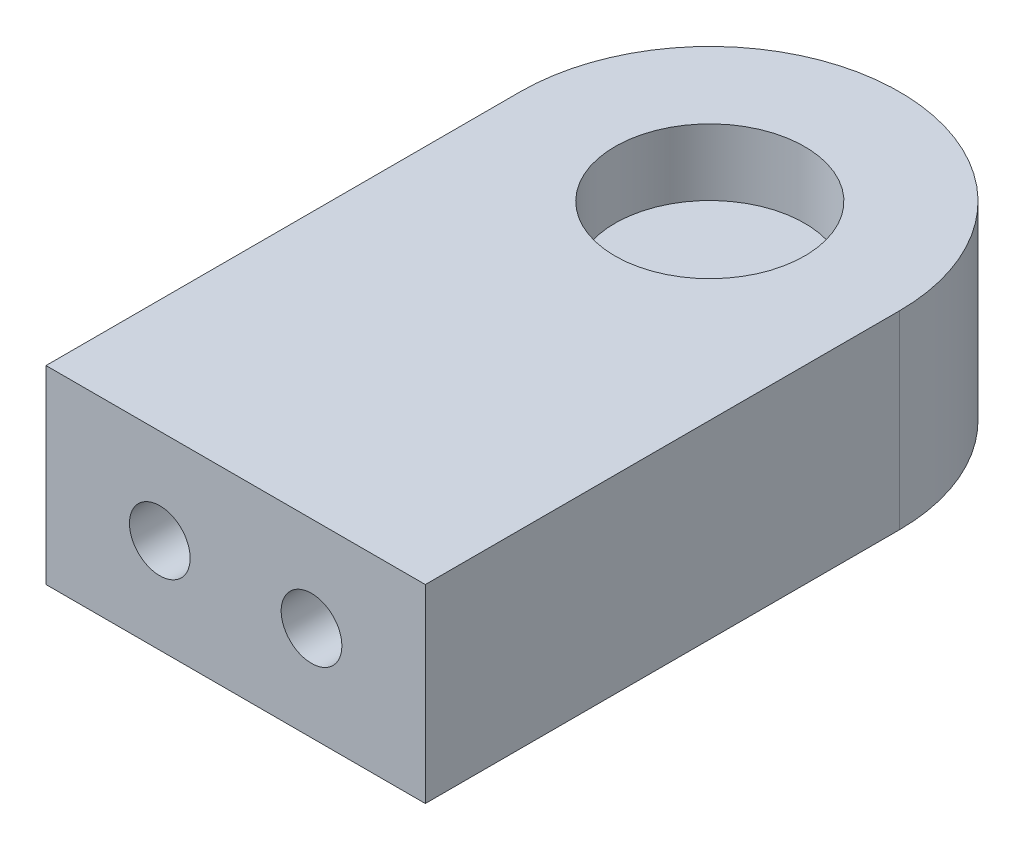
ISO-10303-21;
HEADER;
FILE_DESCRIPTION(('STEP AP214'),'2;1');
FILE_NAME('part.step','',(''),(''),'','','');
FILE_SCHEMA(('AUTOMOTIVE_DESIGN { 1 0 10303 214 1 1 1 1 }'));
ENDSEC;
DATA;
#1=APPLICATION_CONTEXT('core data for automotive mechanical design processes');
#2=APPLICATION_PROTOCOL_DEFINITION('international standard','automotive_design',2000,#1);
#3=PRODUCT_CONTEXT('',#1,'mechanical');
#4=PRODUCT('Part','Part','',(#3));
#5=PRODUCT_RELATED_PRODUCT_CATEGORY('part','',(#4));
#6=PRODUCT_DEFINITION_FORMATION('','',#4);
#7=PRODUCT_DEFINITION_CONTEXT('part definition',#1,'design');
#8=PRODUCT_DEFINITION('design','',#6,#7);
#9=PRODUCT_DEFINITION_SHAPE('','',#8);
#10=(LENGTH_UNIT() NAMED_UNIT(*) SI_UNIT(.MILLI.,.METRE.));
#11=(NAMED_UNIT(*) PLANE_ANGLE_UNIT() SI_UNIT($,.RADIAN.));
#12=(NAMED_UNIT(*) SI_UNIT($,.STERADIAN.) SOLID_ANGLE_UNIT());
#13=UNCERTAINTY_MEASURE_WITH_UNIT(LENGTH_MEASURE(1.E-05),#10,'distance_accuracy_value','');
#14=(GEOMETRIC_REPRESENTATION_CONTEXT(3) GLOBAL_UNCERTAINTY_ASSIGNED_CONTEXT((#13)) GLOBAL_UNIT_ASSIGNED_CONTEXT((#10,
#11,#12)) REPRESENTATION_CONTEXT('',''));
#15=CARTESIAN_POINT('',(0.,0.,0.));
#16=DIRECTION('',(0.,0.,1.));
#17=DIRECTION('',(1.,0.,0.));
#18=AXIS2_PLACEMENT_3D('',#15,#16,#17);
#19=CARTESIAN_POINT('',(20.,10.,0.));
#20=DIRECTION('',(0.,0.,-1.));
#21=DIRECTION('',(-1.,0.,0.));
#22=AXIS2_PLACEMENT_3D('',#19,#20,#21);
#23=PLANE('',#22);
#24=CARTESIAN_POINT('',(14.,5.,0.));
#25=DIRECTION('',(0.,0.,1.));
#26=DIRECTION('',(1.,0.,0.));
#27=AXIS2_PLACEMENT_3D('',#24,#25,#26);
#28=CIRCLE('',#27,1.6);
#29=CARTESIAN_POINT('',(15.6,5.,0.));
#30=VERTEX_POINT('',#29);
#31=EDGE_CURVE('E132',#30,#30,#28,.T.);
#32=ORIENTED_EDGE('',*,*,#31,.F.);
#33=EDGE_LOOP('',(#32));
#34=FACE_BOUND('',#33,.T.);
#35=CARTESIAN_POINT('',(6.,5.,0.));
#36=DIRECTION('',(0.,0.,1.));
#37=DIRECTION('',(1.,0.,0.));
#38=AXIS2_PLACEMENT_3D('',#35,#36,#37);
#39=CIRCLE('',#38,1.6);
#40=CARTESIAN_POINT('',(7.6,5.,0.));
#41=VERTEX_POINT('',#40);
#42=EDGE_CURVE('E126',#41,#41,#39,.T.);
#43=ORIENTED_EDGE('',*,*,#42,.F.);
#44=EDGE_LOOP('',(#43));
#45=FACE_BOUND('',#44,.T.);
#46=DIRECTION('',(1.,0.,0.));
#47=VECTOR('',#46,1.);
#48=CARTESIAN_POINT('',(20.,0.,0.));
#49=LINE('',#48,#47);
#50=CARTESIAN_POINT('',(0.,0.,0.));
#51=VERTEX_POINT('',#50);
#52=CARTESIAN_POINT('',(20.,0.,0.));
#53=VERTEX_POINT('',#52);
#54=EDGE_CURVE('E100',#51,#53,#49,.T.);
#55=ORIENTED_EDGE('',*,*,#54,.T.);
#56=DIRECTION('',(0.,-1.,0.));
#57=VECTOR('',#56,1.);
#58=CARTESIAN_POINT('',(20.,10.,0.));
#59=LINE('',#58,#57);
#60=CARTESIAN_POINT('',(20.,10.,0.));
#61=VERTEX_POINT('',#60);
#62=EDGE_CURVE('E11',#61,#53,#59,.T.);
#63=ORIENTED_EDGE('',*,*,#62,.F.);
#64=DIRECTION('',(1.,0.,0.));
#65=VECTOR('',#64,1.);
#66=CARTESIAN_POINT('',(20.,10.,0.));
#67=LINE('',#66,#65);
#68=CARTESIAN_POINT('',(0.,10.,0.));
#69=VERTEX_POINT('',#68);
#70=EDGE_CURVE('E88',#69,#61,#67,.T.);
#71=ORIENTED_EDGE('',*,*,#70,.F.);
#72=DIRECTION('',(0.,-1.,0.));
#73=VECTOR('',#72,1.);
#74=CARTESIAN_POINT('',(0.,10.,0.));
#75=LINE('',#74,#73);
#76=EDGE_CURVE('E96',#69,#51,#75,.T.);
#77=ORIENTED_EDGE('',*,*,#76,.T.);
#78=EDGE_LOOP('',(#55,#63,#71,#77));
#79=FACE_BOUND('',#78,.T.);
#80=ADVANCED_FACE('F37',(#34,#45,#79),#23,.F.);
#81=CARTESIAN_POINT('',(20.,10.,-25.));
#82=DIRECTION('',(-1.,0.,0.));
#83=DIRECTION('',(0.,0.,1.));
#84=AXIS2_PLACEMENT_3D('',#81,#82,#83);
#85=PLANE('',#84);
#86=DIRECTION('',(0.,0.,-1.));
#87=VECTOR('',#86,1.);
#88=CARTESIAN_POINT('',(20.,0.,-25.));
#89=LINE('',#88,#87);
#90=CARTESIAN_POINT('',(20.,0.,-25.));
#91=VERTEX_POINT('',#90);
#92=EDGE_CURVE('E92',#53,#91,#89,.T.);
#93=ORIENTED_EDGE('',*,*,#92,.T.);
#94=DIRECTION('',(0.,-1.,0.));
#95=VECTOR('',#94,1.);
#96=CARTESIAN_POINT('',(20.,10.,-25.));
#97=LINE('',#96,#95);
#98=CARTESIAN_POINT('',(20.,10.,-25.));
#99=VERTEX_POINT('',#98);
#100=EDGE_CURVE('E45',#99,#91,#97,.T.);
#101=ORIENTED_EDGE('',*,*,#100,.F.);
#102=DIRECTION('',(0.,0.,-1.));
#103=VECTOR('',#102,1.);
#104=CARTESIAN_POINT('',(20.,10.,-25.));
#105=LINE('',#104,#103);
#106=EDGE_CURVE('E83',#61,#99,#105,.T.);
#107=ORIENTED_EDGE('',*,*,#106,.F.);
#108=ORIENTED_EDGE('',*,*,#62,.T.);
#109=EDGE_LOOP('',(#93,#101,#107,#108));
#110=FACE_BOUND('',#109,.T.);
#111=ADVANCED_FACE('F91',(#110),#85,.F.);
#112=CARTESIAN_POINT('',(9.99999999999999,10.,-25.));
#113=DIRECTION('',(0.,-1.,0.));
#114=DIRECTION('',(0.,0.,-1.));
#115=AXIS2_PLACEMENT_3D('',#112,#113,#114);
#116=CYLINDRICAL_SURFACE('',#115,9.99999999999999);
#117=CARTESIAN_POINT('',(9.99999999999999,0.,-25.));
#118=DIRECTION('',(0.,1.,0.));
#119=DIRECTION('',(0.,0.,1.));
#120=AXIS2_PLACEMENT_3D('',#117,#118,#119);
#121=CIRCLE('',#120,9.99999999999999);
#122=CARTESIAN_POINT('',(0.,0.,-25.));
#123=VERTEX_POINT('',#122);
#124=EDGE_CURVE('E70',#91,#123,#121,.T.);
#125=ORIENTED_EDGE('',*,*,#124,.T.);
#126=DIRECTION('',(0.,-1.,0.));
#127=VECTOR('',#126,1.);
#128=CARTESIAN_POINT('',(0.,10.,-25.));
#129=LINE('',#128,#127);
#130=CARTESIAN_POINT('',(0.,10.,-25.));
#131=VERTEX_POINT('',#130);
#132=EDGE_CURVE('E93',#131,#123,#129,.T.);
#133=ORIENTED_EDGE('',*,*,#132,.F.);
#134=CARTESIAN_POINT('',(9.99999999999999,10.,-25.));
#135=DIRECTION('',(0.,1.,0.));
#136=DIRECTION('',(0.,0.,1.));
#137=AXIS2_PLACEMENT_3D('',#134,#135,#136);
#138=CIRCLE('',#137,9.99999999999999);
#139=EDGE_CURVE('E86',#99,#131,#138,.T.);
#140=ORIENTED_EDGE('',*,*,#139,.F.);
#141=ORIENTED_EDGE('',*,*,#100,.T.);
#142=EDGE_LOOP('',(#125,#133,#140,#141));
#143=FACE_BOUND('',#142,.T.);
#144=ADVANCED_FACE('F94',(#143),#116,.T.);
#145=CARTESIAN_POINT('',(0.,10.,0.));
#146=DIRECTION('',(1.,0.,0.));
#147=DIRECTION('',(0.,0.,-1.));
#148=AXIS2_PLACEMENT_3D('',#145,#146,#147);
#149=PLANE('',#148);
#150=DIRECTION('',(0.,0.,1.));
#151=VECTOR('',#150,1.);
#152=CARTESIAN_POINT('',(0.,0.,0.));
#153=LINE('',#152,#151);
#154=EDGE_CURVE('E76',#123,#51,#153,.T.);
#155=ORIENTED_EDGE('',*,*,#154,.T.);
#156=ORIENTED_EDGE('',*,*,#76,.F.);
#157=DIRECTION('',(0.,0.,1.));
#158=VECTOR('',#157,1.);
#159=CARTESIAN_POINT('',(0.,10.,0.));
#160=LINE('',#159,#158);
#161=EDGE_CURVE('E53',#131,#69,#160,.T.);
#162=ORIENTED_EDGE('',*,*,#161,.F.);
#163=ORIENTED_EDGE('',*,*,#132,.T.);
#164=EDGE_LOOP('',(#155,#156,#162,#163));
#165=FACE_BOUND('',#164,.T.);
#166=ADVANCED_FACE('F108',(#165),#149,.F.);
#167=CARTESIAN_POINT('',(9.99999999999999,10.,-25.));
#168=DIRECTION('',(0.,1.,0.));
#169=DIRECTION('',(0.,0.,1.));
#170=AXIS2_PLACEMENT_3D('',#167,#168,#169);
#171=PLANE('',#170);
#172=CARTESIAN_POINT('',(9.99999999999999,10.,-25.));
#173=DIRECTION('',(0.,1.,0.));
#174=DIRECTION('',(0.,0.,1.));
#175=AXIS2_PLACEMENT_3D('',#172,#173,#174);
#176=CIRCLE('',#175,5.);
#177=CARTESIAN_POINT('',(9.99999999999999,10.,-20.));
#178=VERTEX_POINT('',#177);
#179=EDGE_CURVE('E120',#178,#178,#176,.T.);
#180=ORIENTED_EDGE('',*,*,#179,.F.);
#181=EDGE_LOOP('',(#180));
#182=FACE_BOUND('',#181,.T.);
#183=ORIENTED_EDGE('',*,*,#70,.T.);
#184=ORIENTED_EDGE('',*,*,#106,.T.);
#185=ORIENTED_EDGE('',*,*,#139,.T.);
#186=ORIENTED_EDGE('',*,*,#161,.T.);
#187=EDGE_LOOP('',(#183,#184,#185,#186));
#188=FACE_BOUND('',#187,.T.);
#189=ADVANCED_FACE('F84',(#182,#188),#171,.T.);
#190=CARTESIAN_POINT('',(9.99999999999999,0.,-25.));
#191=DIRECTION('',(0.,1.,0.));
#192=DIRECTION('',(0.,0.,1.));
#193=AXIS2_PLACEMENT_3D('',#190,#191,#192);
#194=PLANE('',#193);
#195=CARTESIAN_POINT('',(9.99999999999999,0.,-25.));
#196=DIRECTION('',(0.,1.,0.));
#197=DIRECTION('',(0.,0.,1.));
#198=AXIS2_PLACEMENT_3D('',#195,#196,#197);
#199=CIRCLE('',#198,5.);
#200=CARTESIAN_POINT('',(9.99999999999999,0.,-20.));
#201=VERTEX_POINT('',#200);
#202=EDGE_CURVE('E114',#201,#201,#199,.T.);
#203=ORIENTED_EDGE('',*,*,#202,.T.);
#204=EDGE_LOOP('',(#203));
#205=FACE_BOUND('',#204,.T.);
#206=ORIENTED_EDGE('',*,*,#54,.F.);
#207=ORIENTED_EDGE('',*,*,#154,.F.);
#208=ORIENTED_EDGE('',*,*,#124,.F.);
#209=ORIENTED_EDGE('',*,*,#92,.F.);
#210=EDGE_LOOP('',(#206,#207,#208,#209));
#211=FACE_BOUND('',#210,.T.);
#212=ADVANCED_FACE('F111',(#205,#211),#194,.F.);
#213=CARTESIAN_POINT('',(9.99999999999999,3.5,-25.));
#214=DIRECTION('',(0.,-1.,0.));
#215=DIRECTION('',(0.,0.,-1.));
#216=AXIS2_PLACEMENT_3D('',#213,#214,#215);
#217=CYLINDRICAL_SURFACE('',#216,5.);
#218=CARTESIAN_POINT('',(9.99999999999999,3.5,-25.));
#219=DIRECTION('',(0.,1.,0.));
#220=DIRECTION('',(0.,0.,1.));
#221=AXIS2_PLACEMENT_3D('',#218,#219,#220);
#222=CIRCLE('',#221,5.);
#223=CARTESIAN_POINT('',(9.99999999999999,3.5,-20.));
#224=VERTEX_POINT('',#223);
#225=EDGE_CURVE('E103',#224,#224,#222,.T.);
#226=ORIENTED_EDGE('',*,*,#225,.T.);
#227=EDGE_LOOP('',(#226));
#228=FACE_BOUND('',#227,.T.);
#229=ORIENTED_EDGE('',*,*,#202,.F.);
#230=EDGE_LOOP('',(#229));
#231=FACE_BOUND('',#230,.T.);
#232=ADVANCED_FACE('F173',(#228,#231),#217,.F.);
#233=CARTESIAN_POINT('',(9.99999999999999,3.5,-25.));
#234=DIRECTION('',(0.,1.,0.));
#235=DIRECTION('',(0.,0.,1.));
#236=AXIS2_PLACEMENT_3D('',#233,#234,#235);
#237=PLANE('',#236);
#238=ORIENTED_EDGE('',*,*,#225,.F.);
#239=EDGE_LOOP('',(#238));
#240=FACE_BOUND('',#239,.T.);
#241=ADVANCED_FACE('F169',(#240),#237,.F.);
#242=CARTESIAN_POINT('',(9.99999999999999,6.5,-25.));
#243=DIRECTION('',(0.,1.,0.));
#244=DIRECTION('',(0.,0.,1.));
#245=AXIS2_PLACEMENT_3D('',#242,#243,#244);
#246=CYLINDRICAL_SURFACE('',#245,5.);
#247=CARTESIAN_POINT('',(9.99999999999999,6.5,-25.));
#248=DIRECTION('',(0.,1.,0.));
#249=DIRECTION('',(0.,0.,1.));
#250=AXIS2_PLACEMENT_3D('',#247,#248,#249);
#251=CIRCLE('',#250,5.);
#252=CARTESIAN_POINT('',(9.99999999999999,6.5,-20.));
#253=VERTEX_POINT('',#252);
#254=EDGE_CURVE('E117',#253,#253,#251,.T.);
#255=ORIENTED_EDGE('',*,*,#254,.F.);
#256=EDGE_LOOP('',(#255));
#257=FACE_BOUND('',#256,.T.);
#258=ORIENTED_EDGE('',*,*,#179,.T.);
#259=EDGE_LOOP('',(#258));
#260=FACE_BOUND('',#259,.T.);
#261=ADVANCED_FACE('F162',(#257,#260),#246,.F.);
#262=CARTESIAN_POINT('',(9.99999999999999,6.5,-25.));
#263=DIRECTION('',(0.,1.,0.));
#264=DIRECTION('',(0.,0.,1.));
#265=AXIS2_PLACEMENT_3D('',#262,#263,#264);
#266=PLANE('',#265);
#267=ORIENTED_EDGE('',*,*,#254,.T.);
#268=EDGE_LOOP('',(#267));
#269=FACE_BOUND('',#268,.T.);
#270=ADVANCED_FACE('F153',(#269),#266,.T.);
#271=CARTESIAN_POINT('',(6.,5.,-10.));
#272=DIRECTION('',(0.,0.,1.));
#273=DIRECTION('',(1.,0.,0.));
#274=AXIS2_PLACEMENT_3D('',#271,#272,#273);
#275=CYLINDRICAL_SURFACE('',#274,1.6);
#276=CARTESIAN_POINT('',(6.,5.,-10.));
#277=DIRECTION('',(0.,0.,1.));
#278=DIRECTION('',(1.,0.,0.));
#279=AXIS2_PLACEMENT_3D('',#276,#277,#278);
#280=CIRCLE('',#279,1.6);
#281=CARTESIAN_POINT('',(7.6,5.,-10.));
#282=VERTEX_POINT('',#281);
#283=EDGE_CURVE('E123',#282,#282,#280,.T.);
#284=ORIENTED_EDGE('',*,*,#283,.F.);
#285=EDGE_LOOP('',(#284));
#286=FACE_BOUND('',#285,.T.);
#287=ORIENTED_EDGE('',*,*,#42,.T.);
#288=EDGE_LOOP('',(#287));
#289=FACE_BOUND('',#288,.T.);
#290=ADVANCED_FACE('F151',(#286,#289),#275,.F.);
#291=CARTESIAN_POINT('',(6.,5.,-10.));
#292=DIRECTION('',(0.,0.,1.));
#293=DIRECTION('',(1.,0.,0.));
#294=AXIS2_PLACEMENT_3D('',#291,#292,#293);
#295=PLANE('',#294);
#296=ORIENTED_EDGE('',*,*,#283,.T.);
#297=EDGE_LOOP('',(#296));
#298=FACE_BOUND('',#297,.T.);
#299=ADVANCED_FACE('F143',(#298),#295,.T.);
#300=CARTESIAN_POINT('',(14.,5.,-10.));
#301=DIRECTION('',(0.,0.,1.));
#302=DIRECTION('',(1.,0.,0.));
#303=AXIS2_PLACEMENT_3D('',#300,#301,#302);
#304=CYLINDRICAL_SURFACE('',#303,1.6);
#305=CARTESIAN_POINT('',(14.,5.,-10.));
#306=DIRECTION('',(0.,0.,1.));
#307=DIRECTION('',(1.,0.,0.));
#308=AXIS2_PLACEMENT_3D('',#305,#306,#307);
#309=CIRCLE('',#308,1.6);
#310=CARTESIAN_POINT('',(15.6,5.,-10.));
#311=VERTEX_POINT('',#310);
#312=EDGE_CURVE('E129',#311,#311,#309,.T.);
#313=ORIENTED_EDGE('',*,*,#312,.F.);
#314=EDGE_LOOP('',(#313));
#315=FACE_BOUND('',#314,.T.);
#316=ORIENTED_EDGE('',*,*,#31,.T.);
#317=EDGE_LOOP('',(#316));
#318=FACE_BOUND('',#317,.T.);
#319=ADVANCED_FACE('F140',(#315,#318),#304,.F.);
#320=CARTESIAN_POINT('',(14.,5.,-10.));
#321=DIRECTION('',(0.,0.,1.));
#322=DIRECTION('',(1.,0.,0.));
#323=AXIS2_PLACEMENT_3D('',#320,#321,#322);
#324=PLANE('',#323);
#325=ORIENTED_EDGE('',*,*,#312,.T.);
#326=EDGE_LOOP('',(#325));
#327=FACE_BOUND('',#326,.T.);
#328=ADVANCED_FACE('F138',(#327),#324,.T.);
#329=CLOSED_SHELL('',(#80,#111,#144,#166,#189,#212,#232,#241,#261,#270,#290,#299,#319,#328));
#330=MANIFOLD_SOLID_BREP('B2',#329);
#331=ADVANCED_BREP_SHAPE_REPRESENTATION('',(#18,#330),#14);
#332=SHAPE_DEFINITION_REPRESENTATION(#9,#331);
ENDSEC;
END-ISO-10303-21;
